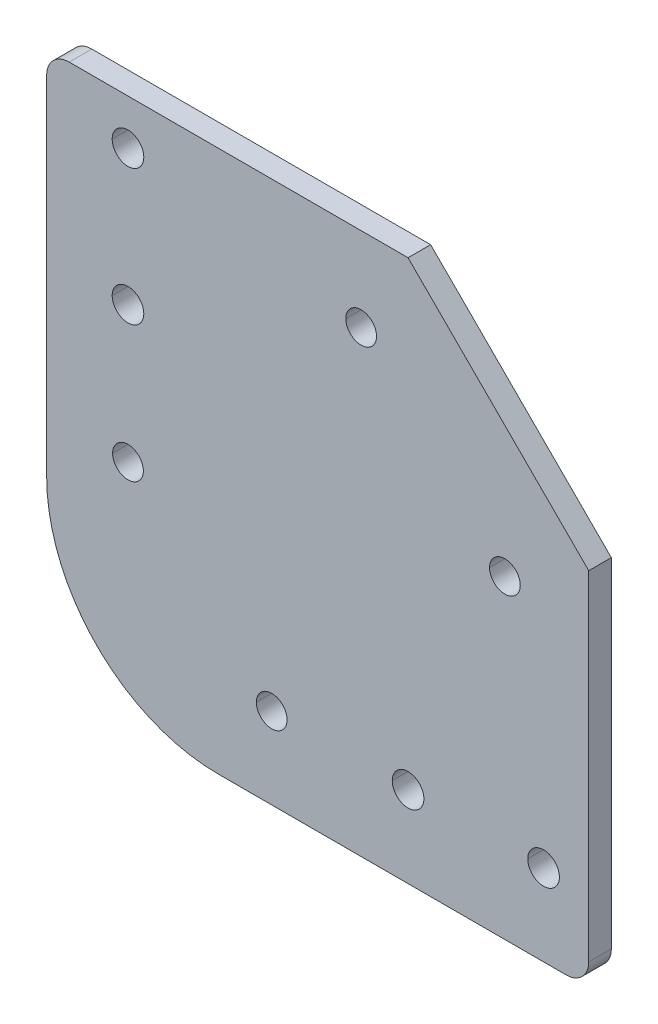
ISO-10303-21;
HEADER;
FILE_DESCRIPTION(('STEP AP214'),'2;1');
FILE_NAME('part.step','',(''),(''),'','','');
FILE_SCHEMA(('AUTOMOTIVE_DESIGN { 1 0 10303 214 1 1 1 1 }'));
ENDSEC;
DATA;
#1=APPLICATION_CONTEXT('core data for automotive mechanical design processes');
#2=APPLICATION_PROTOCOL_DEFINITION('international standard','automotive_design',2000,#1);
#3=PRODUCT_CONTEXT('',#1,'mechanical');
#4=PRODUCT('Part','Part','',(#3));
#5=PRODUCT_RELATED_PRODUCT_CATEGORY('part','',(#4));
#6=PRODUCT_DEFINITION_FORMATION('','',#4);
#7=PRODUCT_DEFINITION_CONTEXT('part definition',#1,'design');
#8=PRODUCT_DEFINITION('design','',#6,#7);
#9=PRODUCT_DEFINITION_SHAPE('','',#8);
#10=(LENGTH_UNIT() NAMED_UNIT(*) SI_UNIT(.MILLI.,.METRE.));
#11=(NAMED_UNIT(*) PLANE_ANGLE_UNIT() SI_UNIT($,.RADIAN.));
#12=(NAMED_UNIT(*) SI_UNIT($,.STERADIAN.) SOLID_ANGLE_UNIT());
#13=UNCERTAINTY_MEASURE_WITH_UNIT(LENGTH_MEASURE(1.E-05),#10,'distance_accuracy_value','');
#14=(GEOMETRIC_REPRESENTATION_CONTEXT(3) GLOBAL_UNCERTAINTY_ASSIGNED_CONTEXT((#13)) GLOBAL_UNIT_ASSIGNED_CONTEXT((#10,
#11,#12)) REPRESENTATION_CONTEXT('',''));
#15=CARTESIAN_POINT('',(0.,0.,0.));
#16=DIRECTION('',(0.,0.,1.));
#17=DIRECTION('',(1.,0.,0.));
#18=AXIS2_PLACEMENT_3D('',#15,#16,#17);
#19=CARTESIAN_POINT('',(9.61879502661761,41.4386001800127,5.));
#20=DIRECTION('',(0.,0.,1.));
#21=DIRECTION('',(1.,0.,0.));
#22=AXIS2_PLACEMENT_3D('',#19,#20,#21);
#23=CYLINDRICAL_SURFACE('',#22,3.4);
#24=CARTESIAN_POINT('',(9.61879502661761,41.4386001800127,0.));
#25=DIRECTION('',(0.,0.,1.));
#26=DIRECTION('',(1.,0.,0.));
#27=AXIS2_PLACEMENT_3D('',#24,#25,#26);
#28=CIRCLE('',#27,3.4);
#29=CARTESIAN_POINT('',(6.21879502661761,41.4386001800127,0.));
#30=VERTEX_POINT('',#29);
#31=CARTESIAN_POINT('',(13.0187950266176,41.4386001800127,0.));
#32=VERTEX_POINT('',#31);
#33=EDGE_CURVE('E42',#30,#32,#28,.T.);
#34=ORIENTED_EDGE('',*,*,#33,.F.);
#35=DIRECTION('',(0.,0.,1.));
#36=VECTOR('',#35,1.);
#37=CARTESIAN_POINT('',(6.21879502661761,41.4386001800127,5.));
#38=LINE('',#37,#36);
#39=CARTESIAN_POINT('',(6.21879502661761,41.4386001800127,5.));
#40=VERTEX_POINT('',#39);
#41=EDGE_CURVE('E11',#30,#40,#38,.T.);
#42=ORIENTED_EDGE('',*,*,#41,.T.);
#43=CARTESIAN_POINT('',(9.61879502661761,41.4386001800127,5.));
#44=DIRECTION('',(0.,0.,1.));
#45=DIRECTION('',(1.,0.,0.));
#46=AXIS2_PLACEMENT_3D('',#43,#44,#45);
#47=CIRCLE('',#46,3.4);
#48=CARTESIAN_POINT('',(13.0187950266176,41.4386001800127,5.));
#49=VERTEX_POINT('',#48);
#50=EDGE_CURVE('E28',#40,#49,#47,.T.);
#51=ORIENTED_EDGE('',*,*,#50,.T.);
#52=DIRECTION('',(0.,0.,1.));
#53=VECTOR('',#52,1.);
#54=CARTESIAN_POINT('',(13.0187950266176,41.4386001800127,5.));
#55=LINE('',#54,#53);
#56=EDGE_CURVE('E399',#32,#49,#55,.T.);
#57=ORIENTED_EDGE('',*,*,#56,.F.);
#58=EDGE_LOOP('',(#34,#42,#51,#57));
#59=FACE_BOUND('',#58,.T.);
#60=ADVANCED_FACE('F17',(#59),#23,.F.);
#61=CARTESIAN_POINT('',(-42.,-10.1801948466058,5.));
#62=DIRECTION('',(0.,0.,1.));
#63=DIRECTION('',(1.,0.,0.));
#64=AXIS2_PLACEMENT_3D('',#61,#62,#63);
#65=CYLINDRICAL_SURFACE('',#64,3.4);
#66=CARTESIAN_POINT('',(-42.,-10.1801948466058,0.));
#67=DIRECTION('',(0.,0.,1.));
#68=DIRECTION('',(1.,0.,0.));
#69=AXIS2_PLACEMENT_3D('',#66,#67,#68);
#70=CIRCLE('',#69,3.4);
#71=CARTESIAN_POINT('',(-45.4,-10.1801948466058,0.));
#72=VERTEX_POINT('',#71);
#73=CARTESIAN_POINT('',(-38.6,-10.1801948466058,0.));
#74=VERTEX_POINT('',#73);
#75=EDGE_CURVE('E261',#72,#74,#70,.T.);
#76=ORIENTED_EDGE('',*,*,#75,.F.);
#77=DIRECTION('',(0.,0.,1.));
#78=VECTOR('',#77,1.);
#79=CARTESIAN_POINT('',(-45.4,-10.1801948466058,5.));
#80=LINE('',#79,#78);
#81=CARTESIAN_POINT('',(-45.4,-10.1801948466058,5.));
#82=VERTEX_POINT('',#81);
#83=EDGE_CURVE('E357',#72,#82,#80,.T.);
#84=ORIENTED_EDGE('',*,*,#83,.T.);
#85=CARTESIAN_POINT('',(-42.,-10.1801948466058,5.));
#86=DIRECTION('',(0.,0.,1.));
#87=DIRECTION('',(1.,0.,0.));
#88=AXIS2_PLACEMENT_3D('',#85,#86,#87);
#89=CIRCLE('',#88,3.4);
#90=CARTESIAN_POINT('',(-38.6,-10.1801948466058,5.));
#91=VERTEX_POINT('',#90);
#92=EDGE_CURVE('E242',#82,#91,#89,.T.);
#93=ORIENTED_EDGE('',*,*,#92,.T.);
#94=DIRECTION('',(0.,0.,1.));
#95=VECTOR('',#94,1.);
#96=CARTESIAN_POINT('',(-38.6,-10.1801948466058,5.));
#97=LINE('',#96,#95);
#98=EDGE_CURVE('E287',#74,#91,#97,.T.);
#99=ORIENTED_EDGE('',*,*,#98,.F.);
#100=EDGE_LOOP('',(#76,#84,#93,#99));
#101=FACE_BOUND('',#100,.T.);
#102=ADVANCED_FACE('F655',(#101),#65,.F.);
#103=CARTESIAN_POINT('',(-10.1801948466051,-42.,5.));
#104=DIRECTION('',(0.,0.,1.));
#105=DIRECTION('',(1.,0.,0.));
#106=AXIS2_PLACEMENT_3D('',#103,#104,#105);
#107=CYLINDRICAL_SURFACE('',#106,3.4);
#108=CARTESIAN_POINT('',(-10.1801948466051,-42.,0.));
#109=DIRECTION('',(0.,0.,1.));
#110=DIRECTION('',(1.,0.,0.));
#111=AXIS2_PLACEMENT_3D('',#108,#109,#110);
#112=CIRCLE('',#111,3.4);
#113=CARTESIAN_POINT('',(-13.5801948466051,-42.,0.));
#114=VERTEX_POINT('',#113);
#115=CARTESIAN_POINT('',(-6.7801948466051,-42.,0.));
#116=VERTEX_POINT('',#115);
#117=EDGE_CURVE('E224',#114,#116,#112,.T.);
#118=ORIENTED_EDGE('',*,*,#117,.F.);
#119=DIRECTION('',(0.,0.,1.));
#120=VECTOR('',#119,1.);
#121=CARTESIAN_POINT('',(-13.5801948466051,-42.,5.));
#122=LINE('',#121,#120);
#123=CARTESIAN_POINT('',(-13.5801948466051,-42.,5.));
#124=VERTEX_POINT('',#123);
#125=EDGE_CURVE('E228',#114,#124,#122,.T.);
#126=ORIENTED_EDGE('',*,*,#125,.T.);
#127=CARTESIAN_POINT('',(-10.1801948466051,-42.,5.));
#128=DIRECTION('',(0.,0.,1.));
#129=DIRECTION('',(1.,0.,0.));
#130=AXIS2_PLACEMENT_3D('',#127,#128,#129);
#131=CIRCLE('',#130,3.4);
#132=CARTESIAN_POINT('',(-6.7801948466051,-42.,5.));
#133=VERTEX_POINT('',#132);
#134=EDGE_CURVE('E243',#124,#133,#131,.T.);
#135=ORIENTED_EDGE('',*,*,#134,.T.);
#136=DIRECTION('',(0.,0.,1.));
#137=VECTOR('',#136,1.);
#138=CARTESIAN_POINT('',(-6.7801948466051,-42.,5.));
#139=LINE('',#138,#137);
#140=EDGE_CURVE('E21',#116,#133,#139,.T.);
#141=ORIENTED_EDGE('',*,*,#140,.F.);
#142=EDGE_LOOP('',(#118,#126,#135,#141));
#143=FACE_BOUND('',#142,.T.);
#144=ADVANCED_FACE('F226',(#143),#107,.F.);
#145=CARTESIAN_POINT('',(41.4386001800125,9.61879502661829,5.));
#146=DIRECTION('',(0.,0.,1.));
#147=DIRECTION('',(1.,0.,0.));
#148=AXIS2_PLACEMENT_3D('',#145,#146,#147);
#149=CYLINDRICAL_SURFACE('',#148,3.4);
#150=CARTESIAN_POINT('',(41.4386001800125,9.61879502661829,0.));
#151=DIRECTION('',(0.,0.,1.));
#152=DIRECTION('',(1.,0.,0.));
#153=AXIS2_PLACEMENT_3D('',#150,#151,#152);
#154=CIRCLE('',#153,3.4);
#155=CARTESIAN_POINT('',(38.0386001800124,9.61879502661829,0.));
#156=VERTEX_POINT('',#155);
#157=CARTESIAN_POINT('',(44.8386001800124,9.61879502661829,0.));
#158=VERTEX_POINT('',#157);
#159=EDGE_CURVE('E247',#156,#158,#154,.T.);
#160=ORIENTED_EDGE('',*,*,#159,.F.);
#161=DIRECTION('',(0.,0.,1.));
#162=VECTOR('',#161,1.);
#163=CARTESIAN_POINT('',(38.0386001800124,9.61879502661829,5.));
#164=LINE('',#163,#162);
#165=CARTESIAN_POINT('',(38.0386001800124,9.61879502661829,5.));
#166=VERTEX_POINT('',#165);
#167=EDGE_CURVE('E376',#156,#166,#164,.T.);
#168=ORIENTED_EDGE('',*,*,#167,.T.);
#169=CARTESIAN_POINT('',(41.4386001800125,9.61879502661829,5.));
#170=DIRECTION('',(0.,0.,1.));
#171=DIRECTION('',(1.,0.,0.));
#172=AXIS2_PLACEMENT_3D('',#169,#170,#171);
#173=CIRCLE('',#172,3.4);
#174=CARTESIAN_POINT('',(44.8386001800124,9.61879502661829,5.));
#175=VERTEX_POINT('',#174);
#176=EDGE_CURVE('E372',#166,#175,#173,.T.);
#177=ORIENTED_EDGE('',*,*,#176,.T.);
#178=DIRECTION('',(0.,0.,1.));
#179=VECTOR('',#178,1.);
#180=CARTESIAN_POINT('',(44.8386001800124,9.61879502661829,5.));
#181=LINE('',#180,#179);
#182=EDGE_CURVE('E270',#158,#175,#181,.T.);
#183=ORIENTED_EDGE('',*,*,#182,.F.);
#184=EDGE_LOOP('',(#160,#168,#177,#183));
#185=FACE_BOUND('',#184,.T.);
#186=ADVANCED_FACE('F546',(#185),#149,.F.);
#187=CARTESIAN_POINT('',(50.,-42.,5.));
#188=DIRECTION('',(0.,0.,-1.));
#189=DIRECTION('',(-1.,0.,0.));
#190=AXIS2_PLACEMENT_3D('',#187,#188,#189);
#191=CYLINDRICAL_SURFACE('',#190,3.5);
#192=CARTESIAN_POINT('',(50.,-42.,5.));
#193=DIRECTION('',(0.,0.,1.));
#194=DIRECTION('',(1.,0.,0.));
#195=AXIS2_PLACEMENT_3D('',#192,#193,#194);
#196=CIRCLE('',#195,3.5);
#197=CARTESIAN_POINT('',(46.5,-42.,5.));
#198=VERTEX_POINT('',#197);
#199=CARTESIAN_POINT('',(53.5,-42.,5.));
#200=VERTEX_POINT('',#199);
#201=EDGE_CURVE('E377',#198,#200,#196,.T.);
#202=ORIENTED_EDGE('',*,*,#201,.T.);
#203=DIRECTION('',(0.,0.,-1.));
#204=VECTOR('',#203,1.);
#205=CARTESIAN_POINT('',(53.5,-42.,5.));
#206=LINE('',#205,#204);
#207=CARTESIAN_POINT('',(53.5,-42.,0.));
#208=VERTEX_POINT('',#207);
#209=EDGE_CURVE('E411',#200,#208,#206,.T.);
#210=ORIENTED_EDGE('',*,*,#209,.T.);
#211=CARTESIAN_POINT('',(50.,-42.,0.));
#212=DIRECTION('',(0.,0.,1.));
#213=DIRECTION('',(1.,0.,0.));
#214=AXIS2_PLACEMENT_3D('',#211,#212,#213);
#215=CIRCLE('',#214,3.5);
#216=CARTESIAN_POINT('',(46.5,-42.,0.));
#217=VERTEX_POINT('',#216);
#218=EDGE_CURVE('E265',#217,#208,#215,.T.);
#219=ORIENTED_EDGE('',*,*,#218,.F.);
#220=DIRECTION('',(0.,0.,-1.));
#221=VECTOR('',#220,1.);
#222=CARTESIAN_POINT('',(46.5,-42.,5.));
#223=LINE('',#222,#221);
#224=EDGE_CURVE('E140',#198,#217,#223,.T.);
#225=ORIENTED_EDGE('',*,*,#224,.F.);
#226=EDGE_LOOP('',(#202,#210,#219,#225));
#227=FACE_BOUND('',#226,.T.);
#228=ADVANCED_FACE('F555',(#227),#191,.F.);
#229=CARTESIAN_POINT('',(20.,-42.,5.));
#230=DIRECTION('',(0.,0.,-1.));
#231=DIRECTION('',(-1.,0.,0.));
#232=AXIS2_PLACEMENT_3D('',#229,#230,#231);
#233=CYLINDRICAL_SURFACE('',#232,3.5);
#234=CARTESIAN_POINT('',(20.,-42.,5.));
#235=DIRECTION('',(0.,0.,1.));
#236=DIRECTION('',(1.,0.,0.));
#237=AXIS2_PLACEMENT_3D('',#234,#235,#236);
#238=CIRCLE('',#237,3.5);
#239=CARTESIAN_POINT('',(16.5,-42.,5.));
#240=VERTEX_POINT('',#239);
#241=CARTESIAN_POINT('',(23.5,-42.,5.));
#242=VERTEX_POINT('',#241);
#243=EDGE_CURVE('E365',#240,#242,#238,.T.);
#244=ORIENTED_EDGE('',*,*,#243,.T.);
#245=DIRECTION('',(0.,0.,-1.));
#246=VECTOR('',#245,1.);
#247=CARTESIAN_POINT('',(23.5,-42.,5.));
#248=LINE('',#247,#246);
#249=CARTESIAN_POINT('',(23.5,-42.,0.));
#250=VERTEX_POINT('',#249);
#251=EDGE_CURVE('E361',#242,#250,#248,.T.);
#252=ORIENTED_EDGE('',*,*,#251,.T.);
#253=CARTESIAN_POINT('',(20.,-42.,0.));
#254=DIRECTION('',(0.,0.,1.));
#255=DIRECTION('',(1.,0.,0.));
#256=AXIS2_PLACEMENT_3D('',#253,#254,#255);
#257=CIRCLE('',#256,3.5);
#258=CARTESIAN_POINT('',(16.5,-42.,0.));
#259=VERTEX_POINT('',#258);
#260=EDGE_CURVE('E366',#259,#250,#257,.T.);
#261=ORIENTED_EDGE('',*,*,#260,.F.);
#262=DIRECTION('',(0.,0.,-1.));
#263=VECTOR('',#262,1.);
#264=CARTESIAN_POINT('',(16.5,-42.,5.));
#265=LINE('',#264,#263);
#266=EDGE_CURVE('E319',#240,#259,#265,.T.);
#267=ORIENTED_EDGE('',*,*,#266,.F.);
#268=EDGE_LOOP('',(#244,#252,#261,#267));
#269=FACE_BOUND('',#268,.T.);
#270=ADVANCED_FACE('F675',(#269),#233,.F.);
#271=CARTESIAN_POINT('',(-42.,20.,5.));
#272=DIRECTION('',(0.,0.,-1.));
#273=DIRECTION('',(-1.,0.,0.));
#274=AXIS2_PLACEMENT_3D('',#271,#272,#273);
#275=CYLINDRICAL_SURFACE('',#274,3.5);
#276=CARTESIAN_POINT('',(-42.,20.,5.));
#277=DIRECTION('',(0.,0.,1.));
#278=DIRECTION('',(1.,0.,0.));
#279=AXIS2_PLACEMENT_3D('',#276,#277,#278);
#280=CIRCLE('',#279,3.5);
#281=CARTESIAN_POINT('',(-45.5,20.,5.));
#282=VERTEX_POINT('',#281);
#283=CARTESIAN_POINT('',(-38.5,20.,5.));
#284=VERTEX_POINT('',#283);
#285=EDGE_CURVE('E324',#282,#284,#280,.T.);
#286=ORIENTED_EDGE('',*,*,#285,.T.);
#287=DIRECTION('',(0.,0.,-1.));
#288=VECTOR('',#287,1.);
#289=CARTESIAN_POINT('',(-38.5,20.,5.));
#290=LINE('',#289,#288);
#291=CARTESIAN_POINT('',(-38.5,20.,0.));
#292=VERTEX_POINT('',#291);
#293=EDGE_CURVE('E320',#284,#292,#290,.T.);
#294=ORIENTED_EDGE('',*,*,#293,.T.);
#295=CARTESIAN_POINT('',(-42.,20.,0.));
#296=DIRECTION('',(0.,0.,1.));
#297=DIRECTION('',(1.,0.,0.));
#298=AXIS2_PLACEMENT_3D('',#295,#296,#297);
#299=CIRCLE('',#298,3.5);
#300=CARTESIAN_POINT('',(-45.5,20.,0.));
#301=VERTEX_POINT('',#300);
#302=EDGE_CURVE('E346',#301,#292,#299,.T.);
#303=ORIENTED_EDGE('',*,*,#302,.F.);
#304=DIRECTION('',(0.,0.,-1.));
#305=VECTOR('',#304,1.);
#306=CARTESIAN_POINT('',(-45.5,20.,5.));
#307=LINE('',#306,#305);
#308=EDGE_CURVE('E330',#282,#301,#307,.T.);
#309=ORIENTED_EDGE('',*,*,#308,.F.);
#310=EDGE_LOOP('',(#286,#294,#303,#309));
#311=FACE_BOUND('',#310,.T.);
#312=ADVANCED_FACE('F671',(#311),#275,.F.);
#313=CARTESIAN_POINT('',(-42.,50.,5.));
#314=DIRECTION('',(0.,0.,-1.));
#315=DIRECTION('',(-1.,0.,0.));
#316=AXIS2_PLACEMENT_3D('',#313,#314,#315);
#317=CYLINDRICAL_SURFACE('',#316,3.5);
#318=CARTESIAN_POINT('',(-42.,50.,5.));
#319=DIRECTION('',(0.,0.,1.));
#320=DIRECTION('',(1.,0.,0.));
#321=AXIS2_PLACEMENT_3D('',#318,#319,#320);
#322=CIRCLE('',#321,3.5);
#323=CARTESIAN_POINT('',(-45.5,50.,5.));
#324=VERTEX_POINT('',#323);
#325=CARTESIAN_POINT('',(-38.5,50.,5.));
#326=VERTEX_POINT('',#325);
#327=EDGE_CURVE('E325',#324,#326,#322,.T.);
#328=ORIENTED_EDGE('',*,*,#327,.T.);
#329=DIRECTION('',(0.,0.,-1.));
#330=VECTOR('',#329,1.);
#331=CARTESIAN_POINT('',(-38.5,50.,5.));
#332=LINE('',#331,#330);
#333=CARTESIAN_POINT('',(-38.5,50.,0.));
#334=VERTEX_POINT('',#333);
#335=EDGE_CURVE('E385',#326,#334,#332,.T.);
#336=ORIENTED_EDGE('',*,*,#335,.T.);
#337=CARTESIAN_POINT('',(-42.,50.,0.));
#338=DIRECTION('',(0.,0.,1.));
#339=DIRECTION('',(1.,0.,0.));
#340=AXIS2_PLACEMENT_3D('',#337,#338,#339);
#341=CIRCLE('',#340,3.5);
#342=CARTESIAN_POINT('',(-45.5,50.,0.));
#343=VERTEX_POINT('',#342);
#344=EDGE_CURVE('E347',#343,#334,#341,.T.);
#345=ORIENTED_EDGE('',*,*,#344,.F.);
#346=DIRECTION('',(0.,0.,-1.));
#347=VECTOR('',#346,1.);
#348=CARTESIAN_POINT('',(-45.5,50.,5.));
#349=LINE('',#348,#347);
#350=EDGE_CURVE('E202',#324,#343,#349,.T.);
#351=ORIENTED_EDGE('',*,*,#350,.F.);
#352=EDGE_LOOP('',(#328,#336,#345,#351));
#353=FACE_BOUND('',#352,.T.);
#354=ADVANCED_FACE('F532',(#353),#317,.F.);
#355=CARTESIAN_POINT('',(-22.,-22.,0.));
#356=DIRECTION('',(0.,0.,-1.));
#357=DIRECTION('',(0.,-1.,0.));
#358=AXIS2_PLACEMENT_3D('',#355,#356,#357);
#359=PLANE('',#358);
#360=DIRECTION('',(-1.,0.,0.));
#361=VECTOR('',#360,1.);
#362=CARTESIAN_POINT('',(60.,60.,0.));
#363=LINE('',#362,#361);
#364=CARTESIAN_POINT('',(20.,60.,0.));
#365=VERTEX_POINT('',#364);
#366=CARTESIAN_POINT('',(-55.,60.,0.));
#367=VERTEX_POINT('',#366);
#368=EDGE_CURVE('E277',#365,#367,#363,.T.);
#369=ORIENTED_EDGE('',*,*,#368,.F.);
#370=DIRECTION('',(0.707106781186547,-0.707106781186549,0.));
#371=VECTOR('',#370,1.);
#372=CARTESIAN_POINT('',(40.,40.,0.));
#373=LINE('',#372,#371);
#374=CARTESIAN_POINT('',(60.,20.,0.));
#375=VERTEX_POINT('',#374);
#376=EDGE_CURVE('E285',#365,#375,#373,.T.);
#377=ORIENTED_EDGE('',*,*,#376,.T.);
#378=DIRECTION('',(0.,1.,0.));
#379=VECTOR('',#378,1.);
#380=CARTESIAN_POINT('',(60.,60.,0.));
#381=LINE('',#380,#379);
#382=CARTESIAN_POINT('',(60.,-55.,0.));
#383=VERTEX_POINT('',#382);
#384=EDGE_CURVE('E382',#383,#375,#381,.T.);
#385=ORIENTED_EDGE('',*,*,#384,.F.);
#386=CARTESIAN_POINT('',(55.,-55.,0.));
#387=DIRECTION('',(0.,0.,-1.));
#388=DIRECTION('',(-1.,0.,0.));
#389=AXIS2_PLACEMENT_3D('',#386,#387,#388);
#390=CIRCLE('',#389,5.);
#391=CARTESIAN_POINT('',(55.,-60.,0.));
#392=VERTEX_POINT('',#391);
#393=EDGE_CURVE('E281',#383,#392,#390,.T.);
#394=ORIENTED_EDGE('',*,*,#393,.T.);
#395=DIRECTION('',(1.,0.,0.));
#396=VECTOR('',#395,1.);
#397=CARTESIAN_POINT('',(60.,-60.,0.));
#398=LINE('',#397,#396);
#399=CARTESIAN_POINT('',(-22.,-60.,0.));
#400=VERTEX_POINT('',#399);
#401=EDGE_CURVE('E407',#400,#392,#398,.T.);
#402=ORIENTED_EDGE('',*,*,#401,.F.);
#403=CARTESIAN_POINT('',(-22.,-22.,0.));
#404=DIRECTION('',(0.,0.,1.));
#405=DIRECTION('',(-1.,0.,0.));
#406=AXIS2_PLACEMENT_3D('',#403,#404,#405);
#407=CIRCLE('',#406,38.);
#408=CARTESIAN_POINT('',(-60.,-22.,0.));
#409=VERTEX_POINT('',#408);
#410=EDGE_CURVE('E331',#409,#400,#407,.T.);
#411=ORIENTED_EDGE('',*,*,#410,.F.);
#412=DIRECTION('',(0.,-1.,0.));
#413=VECTOR('',#412,1.);
#414=CARTESIAN_POINT('',(-60.,60.,0.));
#415=LINE('',#414,#413);
#416=CARTESIAN_POINT('',(-60.,55.,0.));
#417=VERTEX_POINT('',#416);
#418=EDGE_CURVE('E276',#417,#409,#415,.T.);
#419=ORIENTED_EDGE('',*,*,#418,.F.);
#420=CARTESIAN_POINT('',(-55.,55.,0.));
#421=DIRECTION('',(0.,0.,-1.));
#422=DIRECTION('',(-1.,0.,0.));
#423=AXIS2_PLACEMENT_3D('',#420,#421,#422);
#424=CIRCLE('',#423,5.);
#425=EDGE_CURVE('E286',#417,#367,#424,.T.);
#426=ORIENTED_EDGE('',*,*,#425,.T.);
#427=EDGE_LOOP('',(#369,#377,#385,#394,#402,#411,#419,#426));
#428=FACE_BOUND('',#427,.T.);
#429=CARTESIAN_POINT('',(9.61879502661761,41.4386001800127,0.));
#430=DIRECTION('',(0.,0.,1.));
#431=DIRECTION('',(1.,0.,0.));
#432=AXIS2_PLACEMENT_3D('',#429,#430,#431);
#433=CIRCLE('',#432,3.4);
#434=EDGE_CURVE('E389',#32,#30,#433,.T.);
#435=ORIENTED_EDGE('',*,*,#434,.T.);
#436=ORIENTED_EDGE('',*,*,#33,.T.);
#437=EDGE_LOOP('',(#435,#436));
#438=FACE_BOUND('',#437,.T.);
#439=CARTESIAN_POINT('',(-42.,-10.1801948466058,0.));
#440=DIRECTION('',(0.,0.,1.));
#441=DIRECTION('',(1.,0.,0.));
#442=AXIS2_PLACEMENT_3D('',#439,#440,#441);
#443=CIRCLE('',#442,3.4);
#444=EDGE_CURVE('E264',#74,#72,#443,.T.);
#445=ORIENTED_EDGE('',*,*,#444,.T.);
#446=ORIENTED_EDGE('',*,*,#75,.T.);
#447=EDGE_LOOP('',(#445,#446));
#448=FACE_BOUND('',#447,.T.);
#449=ORIENTED_EDGE('',*,*,#218,.T.);
#450=CARTESIAN_POINT('',(50.,-42.,0.));
#451=DIRECTION('',(0.,0.,1.));
#452=DIRECTION('',(1.,0.,0.));
#453=AXIS2_PLACEMENT_3D('',#450,#451,#452);
#454=CIRCLE('',#453,3.5);
#455=EDGE_CURVE('E412',#208,#217,#454,.T.);
#456=ORIENTED_EDGE('',*,*,#455,.T.);
#457=EDGE_LOOP('',(#449,#456));
#458=FACE_BOUND('',#457,.T.);
#459=ORIENTED_EDGE('',*,*,#302,.T.);
#460=CARTESIAN_POINT('',(-42.,20.,0.));
#461=DIRECTION('',(0.,0.,1.));
#462=DIRECTION('',(1.,0.,0.));
#463=AXIS2_PLACEMENT_3D('',#460,#461,#462);
#464=CIRCLE('',#463,3.5);
#465=EDGE_CURVE('E342',#292,#301,#464,.T.);
#466=ORIENTED_EDGE('',*,*,#465,.T.);
#467=EDGE_LOOP('',(#459,#466));
#468=FACE_BOUND('',#467,.T.);
#469=ORIENTED_EDGE('',*,*,#344,.T.);
#470=CARTESIAN_POINT('',(-42.,50.,0.));
#471=DIRECTION('',(0.,0.,1.));
#472=DIRECTION('',(1.,0.,0.));
#473=AXIS2_PLACEMENT_3D('',#470,#471,#472);
#474=CIRCLE('',#473,3.5);
#475=EDGE_CURVE('E370',#334,#343,#474,.T.);
#476=ORIENTED_EDGE('',*,*,#475,.T.);
#477=EDGE_LOOP('',(#469,#476));
#478=FACE_BOUND('',#477,.T.);
#479=ORIENTED_EDGE('',*,*,#260,.T.);
#480=CARTESIAN_POINT('',(20.,-42.,0.));
#481=DIRECTION('',(0.,0.,1.));
#482=DIRECTION('',(1.,0.,0.));
#483=AXIS2_PLACEMENT_3D('',#480,#481,#482);
#484=CIRCLE('',#483,3.5);
#485=EDGE_CURVE('E371',#250,#259,#484,.T.);
#486=ORIENTED_EDGE('',*,*,#485,.T.);
#487=EDGE_LOOP('',(#479,#486));
#488=FACE_BOUND('',#487,.T.);
#489=CARTESIAN_POINT('',(41.4386001800125,9.61879502661829,0.));
#490=DIRECTION('',(0.,0.,1.));
#491=DIRECTION('',(1.,0.,0.));
#492=AXIS2_PLACEMENT_3D('',#489,#490,#491);
#493=CIRCLE('',#492,3.4);
#494=EDGE_CURVE('E255',#158,#156,#493,.T.);
#495=ORIENTED_EDGE('',*,*,#494,.T.);
#496=ORIENTED_EDGE('',*,*,#159,.T.);
#497=EDGE_LOOP('',(#495,#496));
#498=FACE_BOUND('',#497,.T.);
#499=CARTESIAN_POINT('',(-10.1801948466051,-42.,0.));
#500=DIRECTION('',(0.,0.,1.));
#501=DIRECTION('',(1.,0.,0.));
#502=AXIS2_PLACEMENT_3D('',#499,#500,#501);
#503=CIRCLE('',#502,3.4);
#504=EDGE_CURVE('E234',#116,#114,#503,.T.);
#505=ORIENTED_EDGE('',*,*,#504,.T.);
#506=ORIENTED_EDGE('',*,*,#117,.T.);
#507=EDGE_LOOP('',(#505,#506));
#508=FACE_BOUND('',#507,.T.);
#509=ADVANCED_FACE('F245',(#428,#438,#448,#458,#468,#478,#488,#498,#508),#359,.T.);
#510=CARTESIAN_POINT('',(-22.,-22.,5.));
#511=DIRECTION('',(0.,0.,-1.));
#512=DIRECTION('',(0.,-1.,0.));
#513=AXIS2_PLACEMENT_3D('',#510,#511,#512);
#514=PLANE('',#513);
#515=DIRECTION('',(0.,1.,0.));
#516=VECTOR('',#515,1.);
#517=CARTESIAN_POINT('',(60.,60.,5.));
#518=LINE('',#517,#516);
#519=CARTESIAN_POINT('',(60.,-55.,5.));
#520=VERTEX_POINT('',#519);
#521=CARTESIAN_POINT('',(60.,20.,5.));
#522=VERTEX_POINT('',#521);
#523=EDGE_CURVE('E235',#520,#522,#518,.T.);
#524=ORIENTED_EDGE('',*,*,#523,.T.);
#525=DIRECTION('',(-0.707106781186547,0.707106781186549,0.));
#526=VECTOR('',#525,1.);
#527=CARTESIAN_POINT('',(20.,60.,5.));
#528=LINE('',#527,#526);
#529=CARTESIAN_POINT('',(20.,60.,5.));
#530=VERTEX_POINT('',#529);
#531=EDGE_CURVE('E293',#522,#530,#528,.T.);
#532=ORIENTED_EDGE('',*,*,#531,.T.);
#533=DIRECTION('',(-1.,0.,0.));
#534=VECTOR('',#533,1.);
#535=CARTESIAN_POINT('',(60.,60.,5.));
#536=LINE('',#535,#534);
#537=CARTESIAN_POINT('',(-55.,60.,5.));
#538=VERTEX_POINT('',#537);
#539=EDGE_CURVE('E302',#530,#538,#536,.T.);
#540=ORIENTED_EDGE('',*,*,#539,.T.);
#541=CARTESIAN_POINT('',(-55.,55.,5.));
#542=DIRECTION('',(0.,0.,1.));
#543=DIRECTION('',(-1.,0.,0.));
#544=AXIS2_PLACEMENT_3D('',#541,#542,#543);
#545=CIRCLE('',#544,5.);
#546=CARTESIAN_POINT('',(-60.,55.,5.));
#547=VERTEX_POINT('',#546);
#548=EDGE_CURVE('E311',#538,#547,#545,.T.);
#549=ORIENTED_EDGE('',*,*,#548,.T.);
#550=DIRECTION('',(0.,-1.,0.));
#551=VECTOR('',#550,1.);
#552=CARTESIAN_POINT('',(-60.,60.,5.));
#553=LINE('',#552,#551);
#554=CARTESIAN_POINT('',(-60.,-22.,5.));
#555=VERTEX_POINT('',#554);
#556=EDGE_CURVE('E351',#547,#555,#553,.T.);
#557=ORIENTED_EDGE('',*,*,#556,.T.);
#558=CARTESIAN_POINT('',(-22.,-22.,5.));
#559=DIRECTION('',(0.,0.,1.));
#560=DIRECTION('',(-1.,0.,0.));
#561=AXIS2_PLACEMENT_3D('',#558,#559,#560);
#562=CIRCLE('',#561,38.);
#563=CARTESIAN_POINT('',(-22.,-60.,5.));
#564=VERTEX_POINT('',#563);
#565=EDGE_CURVE('E394',#555,#564,#562,.T.);
#566=ORIENTED_EDGE('',*,*,#565,.T.);
#567=DIRECTION('',(1.,0.,0.));
#568=VECTOR('',#567,1.);
#569=CARTESIAN_POINT('',(60.,-60.,5.));
#570=LINE('',#569,#568);
#571=CARTESIAN_POINT('',(55.,-60.,5.));
#572=VERTEX_POINT('',#571);
#573=EDGE_CURVE('E390',#564,#572,#570,.T.);
#574=ORIENTED_EDGE('',*,*,#573,.T.);
#575=CARTESIAN_POINT('',(55.,-55.,5.));
#576=DIRECTION('',(0.,0.,1.));
#577=DIRECTION('',(-1.,0.,0.));
#578=AXIS2_PLACEMENT_3D('',#575,#576,#577);
#579=CIRCLE('',#578,5.);
#580=EDGE_CURVE('E395',#572,#520,#579,.T.);
#581=ORIENTED_EDGE('',*,*,#580,.T.);
#582=EDGE_LOOP('',(#524,#532,#540,#549,#557,#566,#574,#581));
#583=FACE_BOUND('',#582,.T.);
#584=CARTESIAN_POINT('',(9.61879502661761,41.4386001800127,5.));
#585=DIRECTION('',(0.,0.,1.));
#586=DIRECTION('',(1.,0.,0.));
#587=AXIS2_PLACEMENT_3D('',#584,#585,#586);
#588=CIRCLE('',#587,3.4);
#589=EDGE_CURVE('E428',#49,#40,#588,.T.);
#590=ORIENTED_EDGE('',*,*,#589,.F.);
#591=ORIENTED_EDGE('',*,*,#50,.F.);
#592=EDGE_LOOP('',(#590,#591));
#593=FACE_BOUND('',#592,.T.);
#594=CARTESIAN_POINT('',(-42.,-10.1801948466058,5.));
#595=DIRECTION('',(0.,0.,1.));
#596=DIRECTION('',(1.,0.,0.));
#597=AXIS2_PLACEMENT_3D('',#594,#595,#596);
#598=CIRCLE('',#597,3.4);
#599=EDGE_CURVE('E290',#91,#82,#598,.T.);
#600=ORIENTED_EDGE('',*,*,#599,.F.);
#601=ORIENTED_EDGE('',*,*,#92,.F.);
#602=EDGE_LOOP('',(#600,#601));
#603=FACE_BOUND('',#602,.T.);
#604=CARTESIAN_POINT('',(-10.1801948466051,-42.,5.));
#605=DIRECTION('',(0.,0.,1.));
#606=DIRECTION('',(1.,0.,0.));
#607=AXIS2_PLACEMENT_3D('',#604,#605,#606);
#608=CIRCLE('',#607,3.4);
#609=EDGE_CURVE('E240',#133,#124,#608,.T.);
#610=ORIENTED_EDGE('',*,*,#609,.F.);
#611=ORIENTED_EDGE('',*,*,#134,.F.);
#612=EDGE_LOOP('',(#610,#611));
#613=FACE_BOUND('',#612,.T.);
#614=ORIENTED_EDGE('',*,*,#201,.F.);
#615=CARTESIAN_POINT('',(50.,-42.,5.));
#616=DIRECTION('',(0.,0.,1.));
#617=DIRECTION('',(1.,0.,0.));
#618=AXIS2_PLACEMENT_3D('',#615,#616,#617);
#619=CIRCLE('',#618,3.5);
#620=EDGE_CURVE('E316',#200,#198,#619,.T.);
#621=ORIENTED_EDGE('',*,*,#620,.F.);
#622=EDGE_LOOP('',(#614,#621));
#623=FACE_BOUND('',#622,.T.);
#624=ORIENTED_EDGE('',*,*,#243,.F.);
#625=CARTESIAN_POINT('',(20.,-42.,5.));
#626=DIRECTION('',(0.,0.,1.));
#627=DIRECTION('',(1.,0.,0.));
#628=AXIS2_PLACEMENT_3D('',#625,#626,#627);
#629=CIRCLE('',#628,3.5);
#630=EDGE_CURVE('E326',#242,#240,#629,.T.);
#631=ORIENTED_EDGE('',*,*,#630,.F.);
#632=EDGE_LOOP('',(#624,#631));
#633=FACE_BOUND('',#632,.T.);
#634=ORIENTED_EDGE('',*,*,#285,.F.);
#635=CARTESIAN_POINT('',(-42.,20.,5.));
#636=DIRECTION('',(0.,0.,1.));
#637=DIRECTION('',(1.,0.,0.));
#638=AXIS2_PLACEMENT_3D('',#635,#636,#637);
#639=CIRCLE('',#638,3.5);
#640=EDGE_CURVE('E259',#284,#282,#639,.T.);
#641=ORIENTED_EDGE('',*,*,#640,.F.);
#642=EDGE_LOOP('',(#634,#641));
#643=FACE_BOUND('',#642,.T.);
#644=ORIENTED_EDGE('',*,*,#327,.F.);
#645=CARTESIAN_POINT('',(-42.,50.,5.));
#646=DIRECTION('',(0.,0.,1.));
#647=DIRECTION('',(1.,0.,0.));
#648=AXIS2_PLACEMENT_3D('',#645,#646,#647);
#649=CIRCLE('',#648,3.5);
#650=EDGE_CURVE('E336',#326,#324,#649,.T.);
#651=ORIENTED_EDGE('',*,*,#650,.F.);
#652=EDGE_LOOP('',(#644,#651));
#653=FACE_BOUND('',#652,.T.);
#654=CARTESIAN_POINT('',(41.4386001800125,9.61879502661829,5.));
#655=DIRECTION('',(0.,0.,1.));
#656=DIRECTION('',(1.,0.,0.));
#657=AXIS2_PLACEMENT_3D('',#654,#655,#656);
#658=CIRCLE('',#657,3.4);
#659=EDGE_CURVE('E266',#175,#166,#658,.T.);
#660=ORIENTED_EDGE('',*,*,#659,.F.);
#661=ORIENTED_EDGE('',*,*,#176,.F.);
#662=EDGE_LOOP('',(#660,#661));
#663=FACE_BOUND('',#662,.T.);
#664=ADVANCED_FACE('F534',(#583,#593,#603,#613,#623,#633,#643,#653,#663),#514,.F.);
#665=CARTESIAN_POINT('',(60.,60.,5.));
#666=DIRECTION('',(-1.,0.,0.));
#667=DIRECTION('',(0.,1.,0.));
#668=AXIS2_PLACEMENT_3D('',#665,#666,#667);
#669=PLANE('',#668);
#670=ORIENTED_EDGE('',*,*,#384,.T.);
#671=DIRECTION('',(0.,0.,1.));
#672=VECTOR('',#671,1.);
#673=CARTESIAN_POINT('',(60.,20.,5.));
#674=LINE('',#673,#672);
#675=EDGE_CURVE('E356',#375,#522,#674,.T.);
#676=ORIENTED_EDGE('',*,*,#675,.T.);
#677=ORIENTED_EDGE('',*,*,#523,.F.);
#678=DIRECTION('',(0.,0.,-1.));
#679=VECTOR('',#678,1.);
#680=CARTESIAN_POINT('',(60.,-55.,5.));
#681=LINE('',#680,#679);
#682=EDGE_CURVE('E352',#520,#383,#681,.T.);
#683=ORIENTED_EDGE('',*,*,#682,.T.);
#684=EDGE_LOOP('',(#670,#676,#677,#683));
#685=FACE_BOUND('',#684,.T.);
#686=ADVANCED_FACE('F537',(#685),#669,.F.);
#687=CARTESIAN_POINT('',(60.,60.,5.));
#688=DIRECTION('',(0.,-1.,0.));
#689=DIRECTION('',(0.,0.,-1.));
#690=AXIS2_PLACEMENT_3D('',#687,#688,#689);
#691=PLANE('',#690);
#692=ORIENTED_EDGE('',*,*,#539,.F.);
#693=DIRECTION('',(0.,0.,-1.));
#694=VECTOR('',#693,1.);
#695=CARTESIAN_POINT('',(20.,60.,5.));
#696=LINE('',#695,#694);
#697=EDGE_CURVE('E280',#530,#365,#696,.T.);
#698=ORIENTED_EDGE('',*,*,#697,.T.);
#699=ORIENTED_EDGE('',*,*,#368,.T.);
#700=DIRECTION('',(0.,0.,1.));
#701=VECTOR('',#700,1.);
#702=CARTESIAN_POINT('',(-55.,60.,5.));
#703=LINE('',#702,#701);
#704=EDGE_CURVE('E275',#367,#538,#703,.T.);
#705=ORIENTED_EDGE('',*,*,#704,.T.);
#706=EDGE_LOOP('',(#692,#698,#699,#705));
#707=FACE_BOUND('',#706,.T.);
#708=ADVANCED_FACE('F499',(#707),#691,.F.);
#709=CARTESIAN_POINT('',(-60.,60.,5.));
#710=DIRECTION('',(1.,0.,0.));
#711=DIRECTION('',(0.,1.,0.));
#712=AXIS2_PLACEMENT_3D('',#709,#710,#711);
#713=PLANE('',#712);
#714=ORIENTED_EDGE('',*,*,#556,.F.);
#715=DIRECTION('',(0.,0.,-1.));
#716=VECTOR('',#715,1.);
#717=CARTESIAN_POINT('',(-60.,55.,5.));
#718=LINE('',#717,#716);
#719=EDGE_CURVE('E271',#547,#417,#718,.T.);
#720=ORIENTED_EDGE('',*,*,#719,.T.);
#721=ORIENTED_EDGE('',*,*,#418,.T.);
#722=DIRECTION('',(0.,0.,-1.));
#723=VECTOR('',#722,1.);
#724=CARTESIAN_POINT('',(-60.,-22.,5.));
#725=LINE('',#724,#723);
#726=EDGE_CURVE('E335',#555,#409,#725,.T.);
#727=ORIENTED_EDGE('',*,*,#726,.F.);
#728=EDGE_LOOP('',(#714,#720,#721,#727));
#729=FACE_BOUND('',#728,.T.);
#730=ADVANCED_FACE('F604',(#729),#713,.F.);
#731=CARTESIAN_POINT('',(-22.,-22.,5.));
#732=DIRECTION('',(0.,0.,-1.));
#733=DIRECTION('',(-1.,0.,0.));
#734=AXIS2_PLACEMENT_3D('',#731,#732,#733);
#735=CYLINDRICAL_SURFACE('',#734,38.);
#736=ORIENTED_EDGE('',*,*,#410,.T.);
#737=DIRECTION('',(0.,0.,-1.));
#738=VECTOR('',#737,1.);
#739=CARTESIAN_POINT('',(-22.,-60.,5.));
#740=LINE('',#739,#738);
#741=EDGE_CURVE('E338',#564,#400,#740,.T.);
#742=ORIENTED_EDGE('',*,*,#741,.F.);
#743=ORIENTED_EDGE('',*,*,#565,.F.);
#744=ORIENTED_EDGE('',*,*,#726,.T.);
#745=EDGE_LOOP('',(#736,#742,#743,#744));
#746=FACE_BOUND('',#745,.T.);
#747=ADVANCED_FACE('F608',(#746),#735,.T.);
#748=CARTESIAN_POINT('',(60.,-60.,5.));
#749=DIRECTION('',(0.,1.,0.));
#750=DIRECTION('',(1.,0.,0.));
#751=AXIS2_PLACEMENT_3D('',#748,#749,#750);
#752=PLANE('',#751);
#753=ORIENTED_EDGE('',*,*,#401,.T.);
#754=DIRECTION('',(0.,0.,1.));
#755=VECTOR('',#754,1.);
#756=CARTESIAN_POINT('',(55.,-60.,5.));
#757=LINE('',#756,#755);
#758=EDGE_CURVE('E403',#392,#572,#757,.T.);
#759=ORIENTED_EDGE('',*,*,#758,.T.);
#760=ORIENTED_EDGE('',*,*,#573,.F.);
#761=ORIENTED_EDGE('',*,*,#741,.T.);
#762=EDGE_LOOP('',(#753,#759,#760,#761));
#763=FACE_BOUND('',#762,.T.);
#764=ADVANCED_FACE('F646',(#763),#752,.F.);
#765=CARTESIAN_POINT('',(-42.,50.,5.));
#766=DIRECTION('',(0.,0.,-1.));
#767=DIRECTION('',(-1.,0.,0.));
#768=AXIS2_PLACEMENT_3D('',#765,#766,#767);
#769=CYLINDRICAL_SURFACE('',#768,3.5);
#770=ORIENTED_EDGE('',*,*,#335,.F.);
#771=ORIENTED_EDGE('',*,*,#650,.T.);
#772=ORIENTED_EDGE('',*,*,#350,.T.);
#773=ORIENTED_EDGE('',*,*,#475,.F.);
#774=EDGE_LOOP('',(#770,#771,#772,#773));
#775=FACE_BOUND('',#774,.T.);
#776=ADVANCED_FACE('F19',(#775),#769,.F.);
#777=CARTESIAN_POINT('',(-42.,20.,5.));
#778=DIRECTION('',(0.,0.,-1.));
#779=DIRECTION('',(-1.,0.,0.));
#780=AXIS2_PLACEMENT_3D('',#777,#778,#779);
#781=CYLINDRICAL_SURFACE('',#780,3.5);
#782=ORIENTED_EDGE('',*,*,#293,.F.);
#783=ORIENTED_EDGE('',*,*,#640,.T.);
#784=ORIENTED_EDGE('',*,*,#308,.T.);
#785=ORIENTED_EDGE('',*,*,#465,.F.);
#786=EDGE_LOOP('',(#782,#783,#784,#785));
#787=FACE_BOUND('',#786,.T.);
#788=ADVANCED_FACE('F566',(#787),#781,.F.);
#789=CARTESIAN_POINT('',(20.,-42.,5.));
#790=DIRECTION('',(0.,0.,-1.));
#791=DIRECTION('',(-1.,0.,0.));
#792=AXIS2_PLACEMENT_3D('',#789,#790,#791);
#793=CYLINDRICAL_SURFACE('',#792,3.5);
#794=ORIENTED_EDGE('',*,*,#251,.F.);
#795=ORIENTED_EDGE('',*,*,#630,.T.);
#796=ORIENTED_EDGE('',*,*,#266,.T.);
#797=ORIENTED_EDGE('',*,*,#485,.F.);
#798=EDGE_LOOP('',(#794,#795,#796,#797));
#799=FACE_BOUND('',#798,.T.);
#800=ADVANCED_FACE('F712',(#799),#793,.F.);
#801=CARTESIAN_POINT('',(50.,-42.,5.));
#802=DIRECTION('',(0.,0.,-1.));
#803=DIRECTION('',(-1.,0.,0.));
#804=AXIS2_PLACEMENT_3D('',#801,#802,#803);
#805=CYLINDRICAL_SURFACE('',#804,3.5);
#806=ORIENTED_EDGE('',*,*,#209,.F.);
#807=ORIENTED_EDGE('',*,*,#620,.T.);
#808=ORIENTED_EDGE('',*,*,#224,.T.);
#809=ORIENTED_EDGE('',*,*,#455,.F.);
#810=EDGE_LOOP('',(#806,#807,#808,#809));
#811=FACE_BOUND('',#810,.T.);
#812=ADVANCED_FACE('F553',(#811),#805,.F.);
#813=CARTESIAN_POINT('',(55.,-55.,5.));
#814=DIRECTION('',(0.,0.,-1.));
#815=DIRECTION('',(-1.,0.,0.));
#816=AXIS2_PLACEMENT_3D('',#813,#814,#815);
#817=CYLINDRICAL_SURFACE('',#816,5.);
#818=ORIENTED_EDGE('',*,*,#580,.F.);
#819=ORIENTED_EDGE('',*,*,#758,.F.);
#820=ORIENTED_EDGE('',*,*,#393,.F.);
#821=ORIENTED_EDGE('',*,*,#682,.F.);
#822=EDGE_LOOP('',(#818,#819,#820,#821));
#823=FACE_BOUND('',#822,.T.);
#824=ADVANCED_FACE('F698',(#823),#817,.T.);
#825=CARTESIAN_POINT('',(-55.,55.,5.));
#826=DIRECTION('',(0.,0.,-1.));
#827=DIRECTION('',(-1.,0.,0.));
#828=AXIS2_PLACEMENT_3D('',#825,#826,#827);
#829=CYLINDRICAL_SURFACE('',#828,5.);
#830=ORIENTED_EDGE('',*,*,#548,.F.);
#831=ORIENTED_EDGE('',*,*,#704,.F.);
#832=ORIENTED_EDGE('',*,*,#425,.F.);
#833=ORIENTED_EDGE('',*,*,#719,.F.);
#834=EDGE_LOOP('',(#830,#831,#832,#833));
#835=FACE_BOUND('',#834,.T.);
#836=ADVANCED_FACE('F641',(#835),#829,.T.);
#837=CARTESIAN_POINT('',(41.4386001800125,9.61879502661829,5.));
#838=DIRECTION('',(0.,0.,1.));
#839=DIRECTION('',(1.,0.,0.));
#840=AXIS2_PLACEMENT_3D('',#837,#838,#839);
#841=CYLINDRICAL_SURFACE('',#840,3.4);
#842=ORIENTED_EDGE('',*,*,#167,.F.);
#843=ORIENTED_EDGE('',*,*,#494,.F.);
#844=ORIENTED_EDGE('',*,*,#182,.T.);
#845=ORIENTED_EDGE('',*,*,#659,.T.);
#846=EDGE_LOOP('',(#842,#843,#844,#845));
#847=FACE_BOUND('',#846,.T.);
#848=ADVANCED_FACE('F542',(#847),#841,.F.);
#849=CARTESIAN_POINT('',(-10.1801948466051,-42.,5.));
#850=DIRECTION('',(0.,0.,1.));
#851=DIRECTION('',(1.,0.,0.));
#852=AXIS2_PLACEMENT_3D('',#849,#850,#851);
#853=CYLINDRICAL_SURFACE('',#852,3.4);
#854=ORIENTED_EDGE('',*,*,#125,.F.);
#855=ORIENTED_EDGE('',*,*,#504,.F.);
#856=ORIENTED_EDGE('',*,*,#140,.T.);
#857=ORIENTED_EDGE('',*,*,#609,.T.);
#858=EDGE_LOOP('',(#854,#855,#856,#857));
#859=FACE_BOUND('',#858,.T.);
#860=ADVANCED_FACE('F238',(#859),#853,.F.);
#861=CARTESIAN_POINT('',(-42.,-10.1801948466058,5.));
#862=DIRECTION('',(0.,0.,1.));
#863=DIRECTION('',(1.,0.,0.));
#864=AXIS2_PLACEMENT_3D('',#861,#862,#863);
#865=CYLINDRICAL_SURFACE('',#864,3.4);
#866=ORIENTED_EDGE('',*,*,#83,.F.);
#867=ORIENTED_EDGE('',*,*,#444,.F.);
#868=ORIENTED_EDGE('',*,*,#98,.T.);
#869=ORIENTED_EDGE('',*,*,#599,.T.);
#870=EDGE_LOOP('',(#866,#867,#868,#869));
#871=FACE_BOUND('',#870,.T.);
#872=ADVANCED_FACE('F621',(#871),#865,.F.);
#873=CARTESIAN_POINT('',(9.61879502661761,41.4386001800127,5.));
#874=DIRECTION('',(0.,0.,1.));
#875=DIRECTION('',(1.,0.,0.));
#876=AXIS2_PLACEMENT_3D('',#873,#874,#875);
#877=CYLINDRICAL_SURFACE('',#876,3.4);
#878=ORIENTED_EDGE('',*,*,#41,.F.);
#879=ORIENTED_EDGE('',*,*,#434,.F.);
#880=ORIENTED_EDGE('',*,*,#56,.T.);
#881=ORIENTED_EDGE('',*,*,#589,.T.);
#882=EDGE_LOOP('',(#878,#879,#880,#881));
#883=FACE_BOUND('',#882,.T.);
#884=ADVANCED_FACE('F625',(#883),#877,.F.);
#885=CARTESIAN_POINT('',(20.,60.,5.));
#886=DIRECTION('',(-0.707106781186549,-0.707106781186547,0.));
#887=DIRECTION('',(-0.707106781186547,0.707106781186549,0.));
#888=AXIS2_PLACEMENT_3D('',#885,#886,#887);
#889=PLANE('',#888);
#890=ORIENTED_EDGE('',*,*,#531,.F.);
#891=ORIENTED_EDGE('',*,*,#675,.F.);
#892=ORIENTED_EDGE('',*,*,#376,.F.);
#893=ORIENTED_EDGE('',*,*,#697,.F.);
#894=EDGE_LOOP('',(#890,#891,#892,#893));
#895=FACE_BOUND('',#894,.T.);
#896=ADVANCED_FACE('F502',(#895),#889,.F.);
#897=CLOSED_SHELL('',(#60,#102,#144,#186,#228,#270,#312,#354,#509,#664,#686,#708,#730,#747,#764,
#776,#788,#800,#812,#824,#836,#848,#860,#872,#884,#896));
#898=MANIFOLD_SOLID_BREP('B1',#897);
#899=ADVANCED_BREP_SHAPE_REPRESENTATION('',(#18,#898),#14);
#900=SHAPE_DEFINITION_REPRESENTATION(#9,#899);
ENDSEC;
END-ISO-10303-21;
